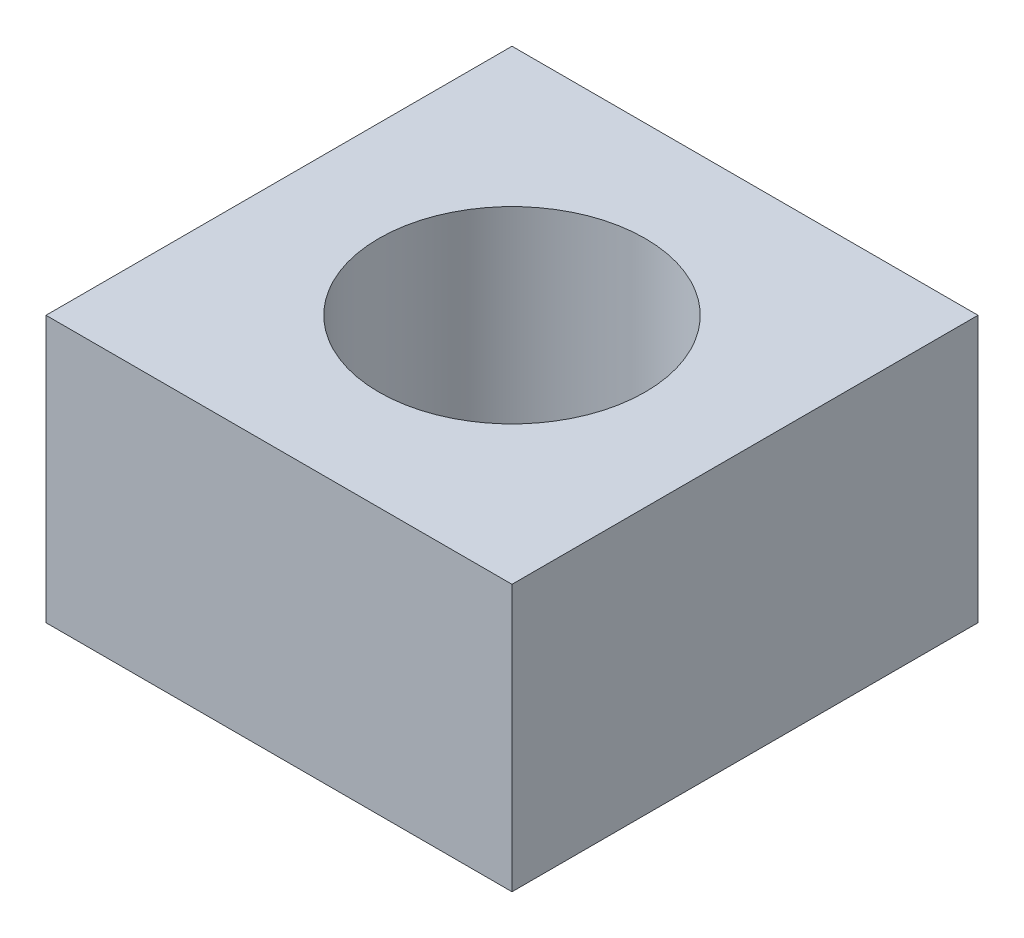
ISO-10303-21;
HEADER;
FILE_DESCRIPTION(('STEP AP214'),'2;1');
FILE_NAME('part.step','',(''),(''),'','','');
FILE_SCHEMA(('AUTOMOTIVE_DESIGN { 1 0 10303 214 1 1 1 1 }'));
ENDSEC;
DATA;
#1=APPLICATION_CONTEXT('core data for automotive mechanical design processes');
#2=APPLICATION_PROTOCOL_DEFINITION('international standard','automotive_design',2000,#1);
#3=PRODUCT_CONTEXT('',#1,'mechanical');
#4=PRODUCT('Part','Part','',(#3));
#5=PRODUCT_RELATED_PRODUCT_CATEGORY('part','',(#4));
#6=PRODUCT_DEFINITION_FORMATION('','',#4);
#7=PRODUCT_DEFINITION_CONTEXT('part definition',#1,'design');
#8=PRODUCT_DEFINITION('design','',#6,#7);
#9=PRODUCT_DEFINITION_SHAPE('','',#8);
#10=(LENGTH_UNIT() NAMED_UNIT(*) SI_UNIT(.MILLI.,.METRE.));
#11=(NAMED_UNIT(*) PLANE_ANGLE_UNIT() SI_UNIT($,.RADIAN.));
#12=(NAMED_UNIT(*) SI_UNIT($,.STERADIAN.) SOLID_ANGLE_UNIT());
#13=UNCERTAINTY_MEASURE_WITH_UNIT(LENGTH_MEASURE(1.E-05),#10,'distance_accuracy_value','');
#14=(GEOMETRIC_REPRESENTATION_CONTEXT(3) GLOBAL_UNCERTAINTY_ASSIGNED_CONTEXT((#13)) GLOBAL_UNIT_ASSIGNED_CONTEXT((#10,
#11,#12)) REPRESENTATION_CONTEXT('',''));
#15=CARTESIAN_POINT('',(0.,0.,0.));
#16=DIRECTION('',(0.,0.,1.));
#17=DIRECTION('',(1.,0.,0.));
#18=AXIS2_PLACEMENT_3D('',#15,#16,#17);
#19=CARTESIAN_POINT('',(0.,4.,0.));
#20=DIRECTION('',(0.,-1.,0.));
#21=DIRECTION('',(0.,0.,-1.));
#22=AXIS2_PLACEMENT_3D('',#19,#20,#21);
#23=PLANE('',#22);
#24=DIRECTION('',(0.,0.,-1.));
#25=VECTOR('',#24,1.);
#26=CARTESIAN_POINT('',(3.5,4.,3.5));
#27=LINE('',#26,#25);
#28=CARTESIAN_POINT('',(3.5,4.,3.5));
#29=VERTEX_POINT('',#28);
#30=CARTESIAN_POINT('',(3.5,4.,-3.5));
#31=VERTEX_POINT('',#30);
#32=EDGE_CURVE('E92',#29,#31,#27,.T.);
#33=ORIENTED_EDGE('',*,*,#32,.T.);
#34=DIRECTION('',(-1.,0.,0.));
#35=VECTOR('',#34,1.);
#36=CARTESIAN_POINT('',(-3.5,4.,-3.5));
#37=LINE('',#36,#35);
#38=CARTESIAN_POINT('',(-3.5,4.,-3.5));
#39=VERTEX_POINT('',#38);
#40=EDGE_CURVE('E87',#31,#39,#37,.T.);
#41=ORIENTED_EDGE('',*,*,#40,.T.);
#42=DIRECTION('',(0.,0.,1.));
#43=VECTOR('',#42,1.);
#44=CARTESIAN_POINT('',(-3.5,4.,3.5));
#45=LINE('',#44,#43);
#46=CARTESIAN_POINT('',(-3.5,4.,3.5));
#47=VERTEX_POINT('',#46);
#48=EDGE_CURVE('E90',#39,#47,#45,.T.);
#49=ORIENTED_EDGE('',*,*,#48,.T.);
#50=DIRECTION('',(1.,0.,0.));
#51=VECTOR('',#50,1.);
#52=CARTESIAN_POINT('',(-3.5,4.,3.5));
#53=LINE('',#52,#51);
#54=EDGE_CURVE('E57',#47,#29,#53,.T.);
#55=ORIENTED_EDGE('',*,*,#54,.T.);
#56=EDGE_LOOP('',(#33,#41,#49,#55));
#57=FACE_BOUND('',#56,.T.);
#58=CARTESIAN_POINT('',(0.,4.,0.));
#59=DIRECTION('',(0.,1.,0.));
#60=DIRECTION('',(0.,0.,1.));
#61=AXIS2_PLACEMENT_3D('',#58,#59,#60);
#62=CIRCLE('',#61,2.);
#63=CARTESIAN_POINT('',(0.,4.,2.));
#64=VERTEX_POINT('',#63);
#65=EDGE_CURVE('E112',#64,#64,#62,.T.);
#66=ORIENTED_EDGE('',*,*,#65,.F.);
#67=EDGE_LOOP('',(#66));
#68=FACE_BOUND('',#67,.T.);
#69=ADVANCED_FACE('F39',(#57,#68),#23,.F.);
#70=CARTESIAN_POINT('',(0.,0.,0.));
#71=DIRECTION('',(0.,-1.,0.));
#72=DIRECTION('',(0.,0.,-1.));
#73=AXIS2_PLACEMENT_3D('',#70,#71,#72);
#74=PLANE('',#73);
#75=DIRECTION('',(0.,0.,-1.));
#76=VECTOR('',#75,1.);
#77=CARTESIAN_POINT('',(3.5,0.,3.5));
#78=LINE('',#77,#76);
#79=CARTESIAN_POINT('',(3.5,0.,3.5));
#80=VERTEX_POINT('',#79);
#81=CARTESIAN_POINT('',(3.5,0.,-3.5));
#82=VERTEX_POINT('',#81);
#83=EDGE_CURVE('E108',#80,#82,#78,.T.);
#84=ORIENTED_EDGE('',*,*,#83,.F.);
#85=DIRECTION('',(1.,0.,0.));
#86=VECTOR('',#85,1.);
#87=CARTESIAN_POINT('',(-3.5,0.,3.5));
#88=LINE('',#87,#86);
#89=CARTESIAN_POINT('',(-3.5,0.,3.5));
#90=VERTEX_POINT('',#89);
#91=EDGE_CURVE('E80',#90,#80,#88,.T.);
#92=ORIENTED_EDGE('',*,*,#91,.F.);
#93=DIRECTION('',(0.,0.,1.));
#94=VECTOR('',#93,1.);
#95=CARTESIAN_POINT('',(-3.5,0.,3.5));
#96=LINE('',#95,#94);
#97=CARTESIAN_POINT('',(-3.5,0.,-3.5));
#98=VERTEX_POINT('',#97);
#99=EDGE_CURVE('E74',#98,#90,#96,.T.);
#100=ORIENTED_EDGE('',*,*,#99,.F.);
#101=DIRECTION('',(-1.,0.,0.));
#102=VECTOR('',#101,1.);
#103=CARTESIAN_POINT('',(-3.5,0.,-3.5));
#104=LINE('',#103,#102);
#105=EDGE_CURVE('E97',#82,#98,#104,.T.);
#106=ORIENTED_EDGE('',*,*,#105,.F.);
#107=EDGE_LOOP('',(#84,#92,#100,#106));
#108=FACE_BOUND('',#107,.T.);
#109=CARTESIAN_POINT('',(0.,0.,0.));
#110=DIRECTION('',(0.,1.,0.));
#111=DIRECTION('',(0.,0.,1.));
#112=AXIS2_PLACEMENT_3D('',#109,#110,#111);
#113=CIRCLE('',#112,2.);
#114=CARTESIAN_POINT('',(0.,0.,2.));
#115=VERTEX_POINT('',#114);
#116=EDGE_CURVE('E130',#115,#115,#113,.T.);
#117=ORIENTED_EDGE('',*,*,#116,.T.);
#118=EDGE_LOOP('',(#117));
#119=FACE_BOUND('',#118,.T.);
#120=ADVANCED_FACE('F125',(#108,#119),#74,.T.);
#121=CARTESIAN_POINT('',(3.5,4.,3.5));
#122=DIRECTION('',(-1.,0.,0.));
#123=DIRECTION('',(0.,0.,1.));
#124=AXIS2_PLACEMENT_3D('',#121,#122,#123);
#125=PLANE('',#124);
#126=ORIENTED_EDGE('',*,*,#83,.T.);
#127=DIRECTION('',(0.,-1.,0.));
#128=VECTOR('',#127,1.);
#129=CARTESIAN_POINT('',(3.5,4.,-3.5));
#130=LINE('',#129,#128);
#131=EDGE_CURVE('E11',#31,#82,#130,.T.);
#132=ORIENTED_EDGE('',*,*,#131,.F.);
#133=ORIENTED_EDGE('',*,*,#32,.F.);
#134=DIRECTION('',(0.,-1.,0.));
#135=VECTOR('',#134,1.);
#136=CARTESIAN_POINT('',(3.5,4.,3.5));
#137=LINE('',#136,#135);
#138=EDGE_CURVE('E104',#29,#80,#137,.T.);
#139=ORIENTED_EDGE('',*,*,#138,.T.);
#140=EDGE_LOOP('',(#126,#132,#133,#139));
#141=FACE_BOUND('',#140,.T.);
#142=ADVANCED_FACE('F41',(#141),#125,.F.);
#143=CARTESIAN_POINT('',(-3.5,4.,-3.5));
#144=DIRECTION('',(0.,0.,1.));
#145=DIRECTION('',(1.,0.,0.));
#146=AXIS2_PLACEMENT_3D('',#143,#144,#145);
#147=PLANE('',#146);
#148=ORIENTED_EDGE('',*,*,#105,.T.);
#149=DIRECTION('',(0.,-1.,0.));
#150=VECTOR('',#149,1.);
#151=CARTESIAN_POINT('',(-3.5,4.,-3.5));
#152=LINE('',#151,#150);
#153=EDGE_CURVE('E49',#39,#98,#152,.T.);
#154=ORIENTED_EDGE('',*,*,#153,.F.);
#155=ORIENTED_EDGE('',*,*,#40,.F.);
#156=ORIENTED_EDGE('',*,*,#131,.T.);
#157=EDGE_LOOP('',(#148,#154,#155,#156));
#158=FACE_BOUND('',#157,.T.);
#159=ADVANCED_FACE('F96',(#158),#147,.F.);
#160=CARTESIAN_POINT('',(-3.5,4.,3.5));
#161=DIRECTION('',(1.,0.,0.));
#162=DIRECTION('',(0.,0.,-1.));
#163=AXIS2_PLACEMENT_3D('',#160,#161,#162);
#164=PLANE('',#163);
#165=ORIENTED_EDGE('',*,*,#99,.T.);
#166=DIRECTION('',(0.,-1.,0.));
#167=VECTOR('',#166,1.);
#168=CARTESIAN_POINT('',(-3.5,4.,3.5));
#169=LINE('',#168,#167);
#170=EDGE_CURVE('E99',#47,#90,#169,.T.);
#171=ORIENTED_EDGE('',*,*,#170,.F.);
#172=ORIENTED_EDGE('',*,*,#48,.F.);
#173=ORIENTED_EDGE('',*,*,#153,.T.);
#174=EDGE_LOOP('',(#165,#171,#172,#173));
#175=FACE_BOUND('',#174,.T.);
#176=ADVANCED_FACE('F100',(#175),#164,.F.);
#177=CARTESIAN_POINT('',(-3.5,4.,3.5));
#178=DIRECTION('',(0.,0.,-1.));
#179=DIRECTION('',(-1.,0.,0.));
#180=AXIS2_PLACEMENT_3D('',#177,#178,#179);
#181=PLANE('',#180);
#182=ORIENTED_EDGE('',*,*,#91,.T.);
#183=ORIENTED_EDGE('',*,*,#138,.F.);
#184=ORIENTED_EDGE('',*,*,#54,.F.);
#185=ORIENTED_EDGE('',*,*,#170,.T.);
#186=EDGE_LOOP('',(#182,#183,#184,#185));
#187=FACE_BOUND('',#186,.T.);
#188=ADVANCED_FACE('F122',(#187),#181,.F.);
#189=CARTESIAN_POINT('',(0.,4.,0.));
#190=DIRECTION('',(0.,-1.,0.));
#191=DIRECTION('',(0.,0.,-1.));
#192=AXIS2_PLACEMENT_3D('',#189,#190,#191);
#193=CYLINDRICAL_SURFACE('',#192,2.);
#194=ORIENTED_EDGE('',*,*,#65,.T.);
#195=EDGE_LOOP('',(#194));
#196=FACE_BOUND('',#195,.T.);
#197=ORIENTED_EDGE('',*,*,#116,.F.);
#198=EDGE_LOOP('',(#197));
#199=FACE_BOUND('',#198,.T.);
#200=ADVANCED_FACE('F138',(#196,#199),#193,.F.);
#201=CLOSED_SHELL('',(#69,#120,#142,#159,#176,#188,#200));
#202=MANIFOLD_SOLID_BREP('B2',#201);
#203=ADVANCED_BREP_SHAPE_REPRESENTATION('',(#18,#202),#14);
#204=SHAPE_DEFINITION_REPRESENTATION(#9,#203);
ENDSEC;
END-ISO-10303-21;
